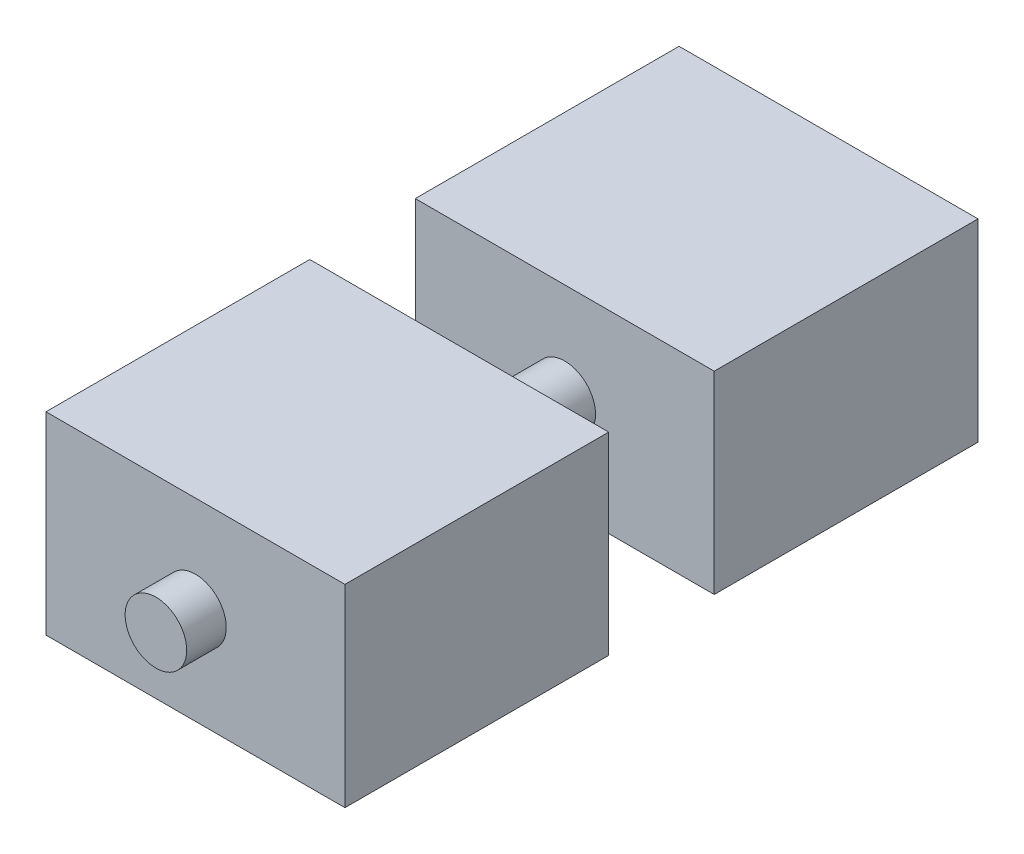
ISO-10303-21;
HEADER;
FILE_DESCRIPTION(('STEP AP214'),'2;1');
FILE_NAME('part.step','',(''),(''),'','','');
FILE_SCHEMA(('AUTOMOTIVE_DESIGN { 1 0 10303 214 1 1 1 1 }'));
ENDSEC;
DATA;
#1=APPLICATION_CONTEXT('core data for automotive mechanical design processes');
#2=APPLICATION_PROTOCOL_DEFINITION('international standard','automotive_design',2000,#1);
#3=PRODUCT_CONTEXT('',#1,'mechanical');
#4=PRODUCT('Part','Part','',(#3));
#5=PRODUCT_RELATED_PRODUCT_CATEGORY('part','',(#4));
#6=PRODUCT_DEFINITION_FORMATION('','',#4);
#7=PRODUCT_DEFINITION_CONTEXT('part definition',#1,'design');
#8=PRODUCT_DEFINITION('design','',#6,#7);
#9=PRODUCT_DEFINITION_SHAPE('','',#8);
#10=(LENGTH_UNIT() NAMED_UNIT(*) SI_UNIT(.MILLI.,.METRE.));
#11=(NAMED_UNIT(*) PLANE_ANGLE_UNIT() SI_UNIT($,.RADIAN.));
#12=(NAMED_UNIT(*) SI_UNIT($,.STERADIAN.) SOLID_ANGLE_UNIT());
#13=UNCERTAINTY_MEASURE_WITH_UNIT(LENGTH_MEASURE(1.E-05),#10,'distance_accuracy_value','');
#14=(GEOMETRIC_REPRESENTATION_CONTEXT(3) GLOBAL_UNCERTAINTY_ASSIGNED_CONTEXT((#13)) GLOBAL_UNIT_ASSIGNED_CONTEXT((#10,
#11,#12)) REPRESENTATION_CONTEXT('',''));
#15=CARTESIAN_POINT('',(0.,0.,0.));
#16=DIRECTION('',(0.,0.,1.));
#17=DIRECTION('',(1.,0.,0.));
#18=AXIS2_PLACEMENT_3D('',#15,#16,#17);
#19=CARTESIAN_POINT('',(0.,11.,-60.));
#20=DIRECTION('',(0.,0.,1.));
#21=DIRECTION('',(1.,0.,0.));
#22=AXIS2_PLACEMENT_3D('',#19,#20,#21);
#23=CYLINDRICAL_SURFACE('',#22,3.5);
#24=CARTESIAN_POINT('',(0.,11.,-15.));
#25=DIRECTION('',(0.,0.,1.));
#26=DIRECTION('',(1.,0.,0.));
#27=AXIS2_PLACEMENT_3D('',#24,#25,#26);
#28=CIRCLE('',#27,3.5);
#29=CARTESIAN_POINT('',(3.5,11.,-15.));
#30=VERTEX_POINT('',#29);
#31=EDGE_CURVE('E153',#30,#30,#28,.T.);
#32=ORIENTED_EDGE('',*,*,#31,.F.);
#33=EDGE_LOOP('',(#32));
#34=FACE_BOUND('',#33,.T.);
#35=CARTESIAN_POINT('',(0.,11.,-27.));
#36=DIRECTION('',(0.,0.,-1.));
#37=DIRECTION('',(-1.,0.,0.));
#38=AXIS2_PLACEMENT_3D('',#35,#36,#37);
#39=CIRCLE('',#38,3.5);
#40=CARTESIAN_POINT('',(-3.5,11.,-27.));
#41=VERTEX_POINT('',#40);
#42=EDGE_CURVE('E139',#41,#41,#39,.F.);
#43=ORIENTED_EDGE('',*,*,#42,.T.);
#44=EDGE_LOOP('',(#43));
#45=FACE_BOUND('',#44,.T.);
#46=ADVANCED_FACE('F37',(#34,#45),#23,.T.);
#47=CARTESIAN_POINT('',(17.,22.,-15.));
#48=DIRECTION('',(-1.,0.,0.));
#49=DIRECTION('',(0.,0.,1.));
#50=AXIS2_PLACEMENT_3D('',#47,#48,#49);
#51=PLANE('',#50);
#52=DIRECTION('',(0.,0.,-1.));
#53=VECTOR('',#52,1.);
#54=CARTESIAN_POINT('',(17.,0.,-15.));
#55=LINE('',#54,#53);
#56=CARTESIAN_POINT('',(17.,0.,15.));
#57=VERTEX_POINT('',#56);
#58=CARTESIAN_POINT('',(17.,0.,-15.));
#59=VERTEX_POINT('',#58);
#60=EDGE_CURVE('E156',#57,#59,#55,.T.);
#61=ORIENTED_EDGE('',*,*,#60,.T.);
#62=DIRECTION('',(0.,-1.,0.));
#63=VECTOR('',#62,1.);
#64=CARTESIAN_POINT('',(17.,22.,-15.));
#65=LINE('',#64,#63);
#66=CARTESIAN_POINT('',(17.,22.,-15.));
#67=VERTEX_POINT('',#66);
#68=EDGE_CURVE('E11',#67,#59,#65,.T.);
#69=ORIENTED_EDGE('',*,*,#68,.F.);
#70=DIRECTION('',(0.,0.,-1.));
#71=VECTOR('',#70,1.);
#72=CARTESIAN_POINT('',(17.,22.,-15.));
#73=LINE('',#72,#71);
#74=CARTESIAN_POINT('',(17.,22.,15.));
#75=VERTEX_POINT('',#74);
#76=EDGE_CURVE('E157',#75,#67,#73,.T.);
#77=ORIENTED_EDGE('',*,*,#76,.F.);
#78=DIRECTION('',(0.,-1.,0.));
#79=VECTOR('',#78,1.);
#80=CARTESIAN_POINT('',(17.,22.,15.));
#81=LINE('',#80,#79);
#82=EDGE_CURVE('E163',#75,#57,#81,.T.);
#83=ORIENTED_EDGE('',*,*,#82,.T.);
#84=EDGE_LOOP('',(#61,#69,#77,#83));
#85=FACE_BOUND('',#84,.T.);
#86=ADVANCED_FACE('F39',(#85),#51,.F.);
#87=CARTESIAN_POINT('',(-17.,22.,-15.));
#88=DIRECTION('',(0.,0.,1.));
#89=DIRECTION('',(1.,0.,0.));
#90=AXIS2_PLACEMENT_3D('',#87,#88,#89);
#91=PLANE('',#90);
#92=ORIENTED_EDGE('',*,*,#31,.T.);
#93=EDGE_LOOP('',(#92));
#94=FACE_BOUND('',#93,.T.);
#95=DIRECTION('',(-1.,0.,0.));
#96=VECTOR('',#95,1.);
#97=CARTESIAN_POINT('',(-17.,0.,-15.));
#98=LINE('',#97,#96);
#99=CARTESIAN_POINT('',(-17.,0.,-15.));
#100=VERTEX_POINT('',#99);
#101=EDGE_CURVE('E166',#59,#100,#98,.T.);
#102=ORIENTED_EDGE('',*,*,#101,.T.);
#103=DIRECTION('',(0.,-1.,0.));
#104=VECTOR('',#103,1.);
#105=CARTESIAN_POINT('',(-17.,22.,-15.));
#106=LINE('',#105,#104);
#107=CARTESIAN_POINT('',(-17.,22.,-15.));
#108=VERTEX_POINT('',#107);
#109=EDGE_CURVE('E47',#108,#100,#106,.T.);
#110=ORIENTED_EDGE('',*,*,#109,.F.);
#111=DIRECTION('',(-1.,0.,0.));
#112=VECTOR('',#111,1.);
#113=CARTESIAN_POINT('',(-17.,22.,-15.));
#114=LINE('',#113,#112);
#115=EDGE_CURVE('E87',#67,#108,#114,.T.);
#116=ORIENTED_EDGE('',*,*,#115,.F.);
#117=ORIENTED_EDGE('',*,*,#68,.T.);
#118=EDGE_LOOP('',(#102,#110,#116,#117));
#119=FACE_BOUND('',#118,.T.);
#120=ADVANCED_FACE('F205',(#94,#119),#91,.F.);
#121=CARTESIAN_POINT('',(-17.,22.,-15.));
#122=DIRECTION('',(1.,0.,0.));
#123=DIRECTION('',(0.,0.,-1.));
#124=AXIS2_PLACEMENT_3D('',#121,#122,#123);
#125=PLANE('',#124);
#126=DIRECTION('',(0.,0.,1.));
#127=VECTOR('',#126,1.);
#128=CARTESIAN_POINT('',(-17.,0.,-15.));
#129=LINE('',#128,#127);
#130=CARTESIAN_POINT('',(-17.,0.,15.));
#131=VERTEX_POINT('',#130);
#132=EDGE_CURVE('E74',#100,#131,#129,.T.);
#133=ORIENTED_EDGE('',*,*,#132,.T.);
#134=DIRECTION('',(0.,-1.,0.));
#135=VECTOR('',#134,1.);
#136=CARTESIAN_POINT('',(-17.,22.,15.));
#137=LINE('',#136,#135);
#138=CARTESIAN_POINT('',(-17.,22.,15.));
#139=VERTEX_POINT('',#138);
#140=EDGE_CURVE('E171',#139,#131,#137,.T.);
#141=ORIENTED_EDGE('',*,*,#140,.F.);
#142=DIRECTION('',(0.,0.,1.));
#143=VECTOR('',#142,1.);
#144=CARTESIAN_POINT('',(-17.,22.,-15.));
#145=LINE('',#144,#143);
#146=EDGE_CURVE('E160',#108,#139,#145,.T.);
#147=ORIENTED_EDGE('',*,*,#146,.F.);
#148=ORIENTED_EDGE('',*,*,#109,.T.);
#149=EDGE_LOOP('',(#133,#141,#147,#148));
#150=FACE_BOUND('',#149,.T.);
#151=ADVANCED_FACE('F305',(#150),#125,.F.);
#152=CARTESIAN_POINT('',(-17.,22.,15.));
#153=DIRECTION('',(0.,0.,-1.));
#154=DIRECTION('',(-1.,0.,0.));
#155=AXIS2_PLACEMENT_3D('',#152,#153,#154);
#156=PLANE('',#155);
#157=CARTESIAN_POINT('',(0.,11.,15.));
#158=DIRECTION('',(0.,0.,-1.));
#159=DIRECTION('',(-1.,0.,0.));
#160=AXIS2_PLACEMENT_3D('',#157,#158,#159);
#161=CIRCLE('',#160,3.5);
#162=CARTESIAN_POINT('',(-3.5,11.,15.));
#163=VERTEX_POINT('',#162);
#164=EDGE_CURVE('E152',#163,#163,#161,.T.);
#165=ORIENTED_EDGE('',*,*,#164,.T.);
#166=EDGE_LOOP('',(#165));
#167=FACE_BOUND('',#166,.T.);
#168=DIRECTION('',(1.,0.,0.));
#169=VECTOR('',#168,1.);
#170=CARTESIAN_POINT('',(-17.,0.,15.));
#171=LINE('',#170,#169);
#172=EDGE_CURVE('E80',#131,#57,#171,.T.);
#173=ORIENTED_EDGE('',*,*,#172,.T.);
#174=ORIENTED_EDGE('',*,*,#82,.F.);
#175=DIRECTION('',(1.,0.,0.));
#176=VECTOR('',#175,1.);
#177=CARTESIAN_POINT('',(-17.,22.,15.));
#178=LINE('',#177,#176);
#179=EDGE_CURVE('E56',#139,#75,#178,.T.);
#180=ORIENTED_EDGE('',*,*,#179,.F.);
#181=ORIENTED_EDGE('',*,*,#140,.T.);
#182=EDGE_LOOP('',(#173,#174,#180,#181));
#183=FACE_BOUND('',#182,.T.);
#184=ADVANCED_FACE('F177',(#167,#183),#156,.F.);
#185=CARTESIAN_POINT('',(0.,22.,0.));
#186=DIRECTION('',(0.,1.,0.));
#187=DIRECTION('',(0.,0.,1.));
#188=AXIS2_PLACEMENT_3D('',#185,#186,#187);
#189=PLANE('',#188);
#190=ORIENTED_EDGE('',*,*,#76,.T.);
#191=ORIENTED_EDGE('',*,*,#115,.T.);
#192=ORIENTED_EDGE('',*,*,#146,.T.);
#193=ORIENTED_EDGE('',*,*,#179,.T.);
#194=EDGE_LOOP('',(#190,#191,#192,#193));
#195=FACE_BOUND('',#194,.T.);
#196=ADVANCED_FACE('F294',(#195),#189,.T.);
#197=CARTESIAN_POINT('',(0.,0.,0.));
#198=DIRECTION('',(0.,1.,0.));
#199=DIRECTION('',(0.,0.,1.));
#200=AXIS2_PLACEMENT_3D('',#197,#198,#199);
#201=PLANE('',#200);
#202=CARTESIAN_POINT('',(12.,0.,8.99999999999999));
#203=DIRECTION('',(0.,-1.,0.));
#204=DIRECTION('',(0.,0.,-1.));
#205=AXIS2_PLACEMENT_3D('',#202,#203,#204);
#206=CIRCLE('',#205,2.05);
#207=CARTESIAN_POINT('',(12.,0.,6.94999999999999));
#208=VERTEX_POINT('',#207);
#209=EDGE_CURVE('E241',#208,#208,#206,.T.);
#210=ORIENTED_EDGE('',*,*,#209,.F.);
#211=EDGE_LOOP('',(#210));
#212=FACE_BOUND('',#211,.T.);
#213=CARTESIAN_POINT('',(12.,0.,-9.00000000000001));
#214=DIRECTION('',(0.,-1.,0.));
#215=DIRECTION('',(0.,0.,-1.));
#216=AXIS2_PLACEMENT_3D('',#213,#214,#215);
#217=CIRCLE('',#216,2.05);
#218=CARTESIAN_POINT('',(12.,0.,-11.05));
#219=VERTEX_POINT('',#218);
#220=EDGE_CURVE('E277',#219,#219,#217,.T.);
#221=ORIENTED_EDGE('',*,*,#220,.F.);
#222=EDGE_LOOP('',(#221));
#223=FACE_BOUND('',#222,.T.);
#224=CARTESIAN_POINT('',(-12.,0.,-9.00000000000001));
#225=DIRECTION('',(0.,-1.,0.));
#226=DIRECTION('',(0.,0.,-1.));
#227=AXIS2_PLACEMENT_3D('',#224,#225,#226);
#228=CIRCLE('',#227,2.05);
#229=CARTESIAN_POINT('',(-12.,0.,-11.05));
#230=VERTEX_POINT('',#229);
#231=EDGE_CURVE('E271',#230,#230,#228,.T.);
#232=ORIENTED_EDGE('',*,*,#231,.F.);
#233=EDGE_LOOP('',(#232));
#234=FACE_BOUND('',#233,.T.);
#235=CARTESIAN_POINT('',(-12.,0.,8.99999999999999));
#236=DIRECTION('',(0.,-1.,0.));
#237=DIRECTION('',(0.,0.,-1.));
#238=AXIS2_PLACEMENT_3D('',#235,#236,#237);
#239=CIRCLE('',#238,2.05);
#240=CARTESIAN_POINT('',(-12.,0.,6.94999999999999));
#241=VERTEX_POINT('',#240);
#242=EDGE_CURVE('E265',#241,#241,#239,.T.);
#243=ORIENTED_EDGE('',*,*,#242,.F.);
#244=EDGE_LOOP('',(#243));
#245=FACE_BOUND('',#244,.T.);
#246=ORIENTED_EDGE('',*,*,#60,.F.);
#247=ORIENTED_EDGE('',*,*,#172,.F.);
#248=ORIENTED_EDGE('',*,*,#132,.F.);
#249=ORIENTED_EDGE('',*,*,#101,.F.);
#250=EDGE_LOOP('',(#246,#247,#248,#249));
#251=FACE_BOUND('',#250,.T.);
#252=ADVANCED_FACE('F190',(#212,#223,#234,#245,#251),#201,.F.);
#253=CARTESIAN_POINT('',(0.,11.,19.5));
#254=DIRECTION('',(0.,0.,1.));
#255=DIRECTION('',(1.,0.,0.));
#256=AXIS2_PLACEMENT_3D('',#253,#254,#255);
#257=PLANE('',#256);
#258=CARTESIAN_POINT('',(0.,11.,19.5));
#259=DIRECTION('',(0.,0.,1.));
#260=DIRECTION('',(1.,0.,0.));
#261=AXIS2_PLACEMENT_3D('',#258,#259,#260);
#262=CIRCLE('',#261,3.5);
#263=CARTESIAN_POINT('',(3.5,11.,19.5));
#264=VERTEX_POINT('',#263);
#265=EDGE_CURVE('E146',#264,#264,#262,.T.);
#266=ORIENTED_EDGE('',*,*,#265,.T.);
#267=EDGE_LOOP('',(#266));
#268=FACE_BOUND('',#267,.T.);
#269=ADVANCED_FACE('F181',(#268),#257,.T.);
#270=ORIENTED_EDGE('',*,*,#265,.F.);
#271=EDGE_LOOP('',(#270));
#272=FACE_BOUND('',#271,.T.);
#273=ORIENTED_EDGE('',*,*,#164,.F.);
#274=EDGE_LOOP('',(#273));
#275=FACE_BOUND('',#274,.T.);
#276=ADVANCED_FACE('F179',(#272,#275),#23,.T.);
#277=CARTESIAN_POINT('',(17.,22.,-57.));
#278=DIRECTION('',(-1.,0.,0.));
#279=DIRECTION('',(0.,0.,1.));
#280=AXIS2_PLACEMENT_3D('',#277,#278,#279);
#281=PLANE('',#280);
#282=DIRECTION('',(0.,0.,-1.));
#283=VECTOR('',#282,1.);
#284=CARTESIAN_POINT('',(17.,0.,-57.));
#285=LINE('',#284,#283);
#286=CARTESIAN_POINT('',(17.,0.,-27.));
#287=VERTEX_POINT('',#286);
#288=CARTESIAN_POINT('',(17.,0.,-57.));
#289=VERTEX_POINT('',#288);
#290=EDGE_CURVE('E138',#287,#289,#285,.T.);
#291=ORIENTED_EDGE('',*,*,#290,.T.);
#292=DIRECTION('',(0.,-1.,0.));
#293=VECTOR('',#292,1.);
#294=CARTESIAN_POINT('',(17.,22.,-57.));
#295=LINE('',#294,#293);
#296=CARTESIAN_POINT('',(17.,22.,-57.));
#297=VERTEX_POINT('',#296);
#298=EDGE_CURVE('E118',#297,#289,#295,.T.);
#299=ORIENTED_EDGE('',*,*,#298,.F.);
#300=DIRECTION('',(0.,0.,-1.));
#301=VECTOR('',#300,1.);
#302=CARTESIAN_POINT('',(17.,22.,-57.));
#303=LINE('',#302,#301);
#304=CARTESIAN_POINT('',(17.,22.,-27.));
#305=VERTEX_POINT('',#304);
#306=EDGE_CURVE('E125',#305,#297,#303,.T.);
#307=ORIENTED_EDGE('',*,*,#306,.F.);
#308=DIRECTION('',(0.,-1.,0.));
#309=VECTOR('',#308,1.);
#310=CARTESIAN_POINT('',(17.,22.,-27.));
#311=LINE('',#310,#309);
#312=EDGE_CURVE('E218',#305,#287,#311,.T.);
#313=ORIENTED_EDGE('',*,*,#312,.T.);
#314=EDGE_LOOP('',(#291,#299,#307,#313));
#315=FACE_BOUND('',#314,.T.);
#316=ADVANCED_FACE('F136',(#315),#281,.F.);
#317=CARTESIAN_POINT('',(-17.,22.,-57.));
#318=DIRECTION('',(0.,0.,1.));
#319=DIRECTION('',(1.,0.,0.));
#320=AXIS2_PLACEMENT_3D('',#317,#318,#319);
#321=PLANE('',#320);
#322=CARTESIAN_POINT('',(0.,11.,-57.));
#323=DIRECTION('',(0.,0.,1.));
#324=DIRECTION('',(1.,0.,0.));
#325=AXIS2_PLACEMENT_3D('',#322,#323,#324);
#326=CIRCLE('',#325,3.5);
#327=CARTESIAN_POINT('',(3.5,11.,-57.));
#328=VERTEX_POINT('',#327);
#329=EDGE_CURVE('E41',#328,#328,#326,.F.);
#330=ORIENTED_EDGE('',*,*,#329,.F.);
#331=EDGE_LOOP('',(#330));
#332=FACE_BOUND('',#331,.T.);
#333=DIRECTION('',(-1.,0.,0.));
#334=VECTOR('',#333,1.);
#335=CARTESIAN_POINT('',(-17.,0.,-57.));
#336=LINE('',#335,#334);
#337=CARTESIAN_POINT('',(-17.,0.,-57.));
#338=VERTEX_POINT('',#337);
#339=EDGE_CURVE('E226',#289,#338,#336,.T.);
#340=ORIENTED_EDGE('',*,*,#339,.T.);
#341=DIRECTION('',(0.,-1.,0.));
#342=VECTOR('',#341,1.);
#343=CARTESIAN_POINT('',(-17.,22.,-57.));
#344=LINE('',#343,#342);
#345=CARTESIAN_POINT('',(-17.,22.,-57.));
#346=VERTEX_POINT('',#345);
#347=EDGE_CURVE('E121',#346,#338,#344,.T.);
#348=ORIENTED_EDGE('',*,*,#347,.F.);
#349=DIRECTION('',(-1.,0.,0.));
#350=VECTOR('',#349,1.);
#351=CARTESIAN_POINT('',(-17.,22.,-57.));
#352=LINE('',#351,#350);
#353=EDGE_CURVE('E114',#297,#346,#352,.T.);
#354=ORIENTED_EDGE('',*,*,#353,.F.);
#355=ORIENTED_EDGE('',*,*,#298,.T.);
#356=EDGE_LOOP('',(#340,#348,#354,#355));
#357=FACE_BOUND('',#356,.T.);
#358=ADVANCED_FACE('F116',(#332,#357),#321,.F.);
#359=CARTESIAN_POINT('',(-17.,22.,-57.));
#360=DIRECTION('',(1.,0.,0.));
#361=DIRECTION('',(0.,0.,-1.));
#362=AXIS2_PLACEMENT_3D('',#359,#360,#361);
#363=PLANE('',#362);
#364=DIRECTION('',(0.,0.,1.));
#365=VECTOR('',#364,1.);
#366=CARTESIAN_POINT('',(-17.,0.,-57.));
#367=LINE('',#366,#365);
#368=CARTESIAN_POINT('',(-17.,0.,-27.));
#369=VERTEX_POINT('',#368);
#370=EDGE_CURVE('E222',#338,#369,#367,.T.);
#371=ORIENTED_EDGE('',*,*,#370,.T.);
#372=DIRECTION('',(0.,-1.,0.));
#373=VECTOR('',#372,1.);
#374=CARTESIAN_POINT('',(-17.,22.,-27.));
#375=LINE('',#374,#373);
#376=CARTESIAN_POINT('',(-17.,22.,-27.));
#377=VERTEX_POINT('',#376);
#378=EDGE_CURVE('E142',#377,#369,#375,.T.);
#379=ORIENTED_EDGE('',*,*,#378,.F.);
#380=DIRECTION('',(0.,0.,1.));
#381=VECTOR('',#380,1.);
#382=CARTESIAN_POINT('',(-17.,22.,-57.));
#383=LINE('',#382,#381);
#384=EDGE_CURVE('E124',#346,#377,#383,.T.);
#385=ORIENTED_EDGE('',*,*,#384,.F.);
#386=ORIENTED_EDGE('',*,*,#347,.T.);
#387=EDGE_LOOP('',(#371,#379,#385,#386));
#388=FACE_BOUND('',#387,.T.);
#389=ADVANCED_FACE('F214',(#388),#363,.F.);
#390=CARTESIAN_POINT('',(-17.,22.,-27.));
#391=DIRECTION('',(0.,0.,-1.));
#392=DIRECTION('',(-1.,0.,0.));
#393=AXIS2_PLACEMENT_3D('',#390,#391,#392);
#394=PLANE('',#393);
#395=ORIENTED_EDGE('',*,*,#42,.F.);
#396=EDGE_LOOP('',(#395));
#397=FACE_BOUND('',#396,.T.);
#398=DIRECTION('',(1.,0.,0.));
#399=VECTOR('',#398,1.);
#400=CARTESIAN_POINT('',(-17.,0.,-27.));
#401=LINE('',#400,#399);
#402=EDGE_CURVE('E134',#369,#287,#401,.T.);
#403=ORIENTED_EDGE('',*,*,#402,.T.);
#404=ORIENTED_EDGE('',*,*,#312,.F.);
#405=DIRECTION('',(1.,0.,0.));
#406=VECTOR('',#405,1.);
#407=CARTESIAN_POINT('',(-17.,22.,-27.));
#408=LINE('',#407,#406);
#409=EDGE_CURVE('E130',#377,#305,#408,.T.);
#410=ORIENTED_EDGE('',*,*,#409,.F.);
#411=ORIENTED_EDGE('',*,*,#378,.T.);
#412=EDGE_LOOP('',(#403,#404,#410,#411));
#413=FACE_BOUND('',#412,.T.);
#414=ADVANCED_FACE('F211',(#397,#413),#394,.F.);
#415=CARTESIAN_POINT('',(0.,22.,0.));
#416=DIRECTION('',(0.,1.,0.));
#417=DIRECTION('',(0.,0.,1.));
#418=AXIS2_PLACEMENT_3D('',#415,#416,#417);
#419=PLANE('',#418);
#420=ORIENTED_EDGE('',*,*,#306,.T.);
#421=ORIENTED_EDGE('',*,*,#353,.T.);
#422=ORIENTED_EDGE('',*,*,#384,.T.);
#423=ORIENTED_EDGE('',*,*,#409,.T.);
#424=EDGE_LOOP('',(#420,#421,#422,#423));
#425=FACE_BOUND('',#424,.T.);
#426=ADVANCED_FACE('F128',(#425),#419,.T.);
#427=CARTESIAN_POINT('',(0.,0.,0.));
#428=DIRECTION('',(0.,1.,0.));
#429=DIRECTION('',(0.,0.,1.));
#430=AXIS2_PLACEMENT_3D('',#427,#428,#429);
#431=PLANE('',#430);
#432=CARTESIAN_POINT('',(-11.75,0.,-33.25));
#433=DIRECTION('',(0.,-1.,0.));
#434=DIRECTION('',(0.,0.,-1.));
#435=AXIS2_PLACEMENT_3D('',#432,#433,#434);
#436=CIRCLE('',#435,2.05000000000001);
#437=CARTESIAN_POINT('',(-11.75,0.,-35.3));
#438=VERTEX_POINT('',#437);
#439=EDGE_CURVE('E260',#438,#438,#436,.T.);
#440=ORIENTED_EDGE('',*,*,#439,.F.);
#441=EDGE_LOOP('',(#440));
#442=FACE_BOUND('',#441,.T.);
#443=CARTESIAN_POINT('',(-11.75,0.,-50.75));
#444=DIRECTION('',(0.,-1.,0.));
#445=DIRECTION('',(0.,0.,-1.));
#446=AXIS2_PLACEMENT_3D('',#443,#444,#445);
#447=CIRCLE('',#446,2.05000000000001);
#448=CARTESIAN_POINT('',(-11.75,0.,-52.8));
#449=VERTEX_POINT('',#448);
#450=EDGE_CURVE('E254',#449,#449,#447,.T.);
#451=ORIENTED_EDGE('',*,*,#450,.F.);
#452=EDGE_LOOP('',(#451));
#453=FACE_BOUND('',#452,.T.);
#454=CARTESIAN_POINT('',(11.75,0.,-50.75));
#455=DIRECTION('',(0.,-1.,0.));
#456=DIRECTION('',(0.,0.,-1.));
#457=AXIS2_PLACEMENT_3D('',#454,#455,#456);
#458=CIRCLE('',#457,2.05000000000001);
#459=CARTESIAN_POINT('',(11.75,0.,-52.8));
#460=VERTEX_POINT('',#459);
#461=EDGE_CURVE('E248',#460,#460,#458,.T.);
#462=ORIENTED_EDGE('',*,*,#461,.F.);
#463=EDGE_LOOP('',(#462));
#464=FACE_BOUND('',#463,.T.);
#465=CARTESIAN_POINT('',(11.75,0.,-33.25));
#466=DIRECTION('',(0.,-1.,0.));
#467=DIRECTION('',(0.,0.,-1.));
#468=AXIS2_PLACEMENT_3D('',#465,#466,#467);
#469=CIRCLE('',#468,2.05000000000001);
#470=CARTESIAN_POINT('',(11.75,0.,-35.3));
#471=VERTEX_POINT('',#470);
#472=EDGE_CURVE('E231',#471,#471,#469,.T.);
#473=ORIENTED_EDGE('',*,*,#472,.F.);
#474=EDGE_LOOP('',(#473));
#475=FACE_BOUND('',#474,.T.);
#476=ORIENTED_EDGE('',*,*,#290,.F.);
#477=ORIENTED_EDGE('',*,*,#402,.F.);
#478=ORIENTED_EDGE('',*,*,#370,.F.);
#479=ORIENTED_EDGE('',*,*,#339,.F.);
#480=EDGE_LOOP('',(#476,#477,#478,#479));
#481=FACE_BOUND('',#480,.T.);
#482=ADVANCED_FACE('F225',(#442,#453,#464,#475,#481),#431,.F.);
#483=CARTESIAN_POINT('',(0.,11.,-60.));
#484=DIRECTION('',(0.,0.,1.));
#485=DIRECTION('',(1.,0.,0.));
#486=AXIS2_PLACEMENT_3D('',#483,#484,#485);
#487=PLANE('',#486);
#488=CARTESIAN_POINT('',(0.,11.,-60.));
#489=DIRECTION('',(0.,0.,1.));
#490=DIRECTION('',(1.,0.,0.));
#491=AXIS2_PLACEMENT_3D('',#488,#489,#490);
#492=CIRCLE('',#491,3.5);
#493=CARTESIAN_POINT('',(3.5,11.,-60.));
#494=VERTEX_POINT('',#493);
#495=EDGE_CURVE('E149',#494,#494,#492,.T.);
#496=ORIENTED_EDGE('',*,*,#495,.F.);
#497=EDGE_LOOP('',(#496));
#498=FACE_BOUND('',#497,.T.);
#499=ADVANCED_FACE('F198',(#498),#487,.F.);
#500=ORIENTED_EDGE('',*,*,#495,.T.);
#501=EDGE_LOOP('',(#500));
#502=FACE_BOUND('',#501,.T.);
#503=ORIENTED_EDGE('',*,*,#329,.T.);
#504=EDGE_LOOP('',(#503));
#505=FACE_BOUND('',#504,.T.);
#506=ADVANCED_FACE('F184',(#502,#505),#23,.T.);
#507=CARTESIAN_POINT('',(11.75,5.,-33.25));
#508=DIRECTION('',(0.,-1.,0.));
#509=DIRECTION('',(0.,0.,-1.));
#510=AXIS2_PLACEMENT_3D('',#507,#508,#509);
#511=CYLINDRICAL_SURFACE('',#510,2.05000000000001);
#512=CARTESIAN_POINT('',(11.75,5.,-33.25));
#513=DIRECTION('',(0.,-1.,0.));
#514=DIRECTION('',(0.,0.,-1.));
#515=AXIS2_PLACEMENT_3D('',#512,#513,#514);
#516=CIRCLE('',#515,2.05000000000001);
#517=CARTESIAN_POINT('',(11.75,5.,-35.3));
#518=VERTEX_POINT('',#517);
#519=EDGE_CURVE('E227',#518,#518,#516,.T.);
#520=ORIENTED_EDGE('',*,*,#519,.F.);
#521=EDGE_LOOP('',(#520));
#522=FACE_BOUND('',#521,.T.);
#523=ORIENTED_EDGE('',*,*,#472,.T.);
#524=EDGE_LOOP('',(#523));
#525=FACE_BOUND('',#524,.T.);
#526=ADVANCED_FACE('F197',(#522,#525),#511,.F.);
#527=CARTESIAN_POINT('',(11.75,5.,-33.25));
#528=DIRECTION('',(0.,-1.,0.));
#529=DIRECTION('',(0.,0.,-1.));
#530=AXIS2_PLACEMENT_3D('',#527,#528,#529);
#531=PLANE('',#530);
#532=ORIENTED_EDGE('',*,*,#519,.T.);
#533=EDGE_LOOP('',(#532));
#534=FACE_BOUND('',#533,.T.);
#535=ADVANCED_FACE('F398',(#534),#531,.T.);
#536=CARTESIAN_POINT('',(11.75,5.,-50.75));
#537=DIRECTION('',(0.,-1.,0.));
#538=DIRECTION('',(0.,0.,-1.));
#539=AXIS2_PLACEMENT_3D('',#536,#537,#538);
#540=CYLINDRICAL_SURFACE('',#539,2.05000000000001);
#541=CARTESIAN_POINT('',(11.75,5.,-50.75));
#542=DIRECTION('',(0.,-1.,0.));
#543=DIRECTION('',(0.,0.,-1.));
#544=AXIS2_PLACEMENT_3D('',#541,#542,#543);
#545=CIRCLE('',#544,2.05000000000001);
#546=CARTESIAN_POINT('',(11.75,5.,-52.8));
#547=VERTEX_POINT('',#546);
#548=EDGE_CURVE('E251',#547,#547,#545,.T.);
#549=ORIENTED_EDGE('',*,*,#548,.F.);
#550=EDGE_LOOP('',(#549));
#551=FACE_BOUND('',#550,.T.);
#552=ORIENTED_EDGE('',*,*,#461,.T.);
#553=EDGE_LOOP('',(#552));
#554=FACE_BOUND('',#553,.T.);
#555=ADVANCED_FACE('F405',(#551,#554),#540,.F.);
#556=CARTESIAN_POINT('',(11.75,5.,-50.75));
#557=DIRECTION('',(0.,-1.,0.));
#558=DIRECTION('',(0.,0.,-1.));
#559=AXIS2_PLACEMENT_3D('',#556,#557,#558);
#560=PLANE('',#559);
#561=ORIENTED_EDGE('',*,*,#548,.T.);
#562=EDGE_LOOP('',(#561));
#563=FACE_BOUND('',#562,.T.);
#564=ADVANCED_FACE('F413',(#563),#560,.T.);
#565=CARTESIAN_POINT('',(-11.75,5.,-50.75));
#566=DIRECTION('',(0.,-1.,0.));
#567=DIRECTION('',(0.,0.,-1.));
#568=AXIS2_PLACEMENT_3D('',#565,#566,#567);
#569=CYLINDRICAL_SURFACE('',#568,2.05000000000001);
#570=CARTESIAN_POINT('',(-11.75,5.,-50.75));
#571=DIRECTION('',(0.,-1.,0.));
#572=DIRECTION('',(0.,0.,-1.));
#573=AXIS2_PLACEMENT_3D('',#570,#571,#572);
#574=CIRCLE('',#573,2.05000000000001);
#575=CARTESIAN_POINT('',(-11.75,5.,-52.8));
#576=VERTEX_POINT('',#575);
#577=EDGE_CURVE('E257',#576,#576,#574,.T.);
#578=ORIENTED_EDGE('',*,*,#577,.F.);
#579=EDGE_LOOP('',(#578));
#580=FACE_BOUND('',#579,.T.);
#581=ORIENTED_EDGE('',*,*,#450,.T.);
#582=EDGE_LOOP('',(#581));
#583=FACE_BOUND('',#582,.T.);
#584=ADVANCED_FACE('F421',(#580,#583),#569,.F.);
#585=CARTESIAN_POINT('',(-11.75,5.,-50.75));
#586=DIRECTION('',(0.,-1.,0.));
#587=DIRECTION('',(0.,0.,-1.));
#588=AXIS2_PLACEMENT_3D('',#585,#586,#587);
#589=PLANE('',#588);
#590=ORIENTED_EDGE('',*,*,#577,.T.);
#591=EDGE_LOOP('',(#590));
#592=FACE_BOUND('',#591,.T.);
#593=ADVANCED_FACE('F429',(#592),#589,.T.);
#594=CARTESIAN_POINT('',(-11.75,5.,-33.25));
#595=DIRECTION('',(0.,-1.,0.));
#596=DIRECTION('',(0.,0.,-1.));
#597=AXIS2_PLACEMENT_3D('',#594,#595,#596);
#598=CYLINDRICAL_SURFACE('',#597,2.05000000000001);
#599=CARTESIAN_POINT('',(-11.75,5.,-33.25));
#600=DIRECTION('',(0.,-1.,0.));
#601=DIRECTION('',(0.,0.,-1.));
#602=AXIS2_PLACEMENT_3D('',#599,#600,#601);
#603=CIRCLE('',#602,2.05000000000001);
#604=CARTESIAN_POINT('',(-11.75,5.,-35.3));
#605=VERTEX_POINT('',#604);
#606=EDGE_CURVE('E239',#605,#605,#603,.T.);
#607=ORIENTED_EDGE('',*,*,#606,.F.);
#608=EDGE_LOOP('',(#607));
#609=FACE_BOUND('',#608,.T.);
#610=ORIENTED_EDGE('',*,*,#439,.T.);
#611=EDGE_LOOP('',(#610));
#612=FACE_BOUND('',#611,.T.);
#613=ADVANCED_FACE('F437',(#609,#612),#598,.F.);
#614=CARTESIAN_POINT('',(-11.75,5.,-33.25));
#615=DIRECTION('',(0.,-1.,0.));
#616=DIRECTION('',(0.,0.,-1.));
#617=AXIS2_PLACEMENT_3D('',#614,#615,#616);
#618=PLANE('',#617);
#619=ORIENTED_EDGE('',*,*,#606,.T.);
#620=EDGE_LOOP('',(#619));
#621=FACE_BOUND('',#620,.T.);
#622=ADVANCED_FACE('F445',(#621),#618,.T.);
#623=CARTESIAN_POINT('',(-12.,5.,8.99999999999999));
#624=DIRECTION('',(0.,-1.,0.));
#625=DIRECTION('',(0.,0.,-1.));
#626=AXIS2_PLACEMENT_3D('',#623,#624,#625);
#627=CYLINDRICAL_SURFACE('',#626,2.05);
#628=CARTESIAN_POINT('',(-12.,5.,8.99999999999999));
#629=DIRECTION('',(0.,-1.,0.));
#630=DIRECTION('',(0.,0.,-1.));
#631=AXIS2_PLACEMENT_3D('',#628,#629,#630);
#632=CIRCLE('',#631,2.05);
#633=CARTESIAN_POINT('',(-12.,5.,6.94999999999999));
#634=VERTEX_POINT('',#633);
#635=EDGE_CURVE('E268',#634,#634,#632,.T.);
#636=ORIENTED_EDGE('',*,*,#635,.F.);
#637=EDGE_LOOP('',(#636));
#638=FACE_BOUND('',#637,.T.);
#639=ORIENTED_EDGE('',*,*,#242,.T.);
#640=EDGE_LOOP('',(#639));
#641=FACE_BOUND('',#640,.T.);
#642=ADVANCED_FACE('F453',(#638,#641),#627,.F.);
#643=CARTESIAN_POINT('',(-12.,5.,8.99999999999999));
#644=DIRECTION('',(0.,-1.,0.));
#645=DIRECTION('',(0.,0.,-1.));
#646=AXIS2_PLACEMENT_3D('',#643,#644,#645);
#647=PLANE('',#646);
#648=ORIENTED_EDGE('',*,*,#635,.T.);
#649=EDGE_LOOP('',(#648));
#650=FACE_BOUND('',#649,.T.);
#651=ADVANCED_FACE('F461',(#650),#647,.T.);
#652=CARTESIAN_POINT('',(-12.,5.,-9.00000000000001));
#653=DIRECTION('',(0.,-1.,0.));
#654=DIRECTION('',(0.,0.,-1.));
#655=AXIS2_PLACEMENT_3D('',#652,#653,#654);
#656=CYLINDRICAL_SURFACE('',#655,2.05);
#657=CARTESIAN_POINT('',(-12.,5.,-9.00000000000001));
#658=DIRECTION('',(0.,-1.,0.));
#659=DIRECTION('',(0.,0.,-1.));
#660=AXIS2_PLACEMENT_3D('',#657,#658,#659);
#661=CIRCLE('',#660,2.05);
#662=CARTESIAN_POINT('',(-12.,5.,-11.05));
#663=VERTEX_POINT('',#662);
#664=EDGE_CURVE('E274',#663,#663,#661,.T.);
#665=ORIENTED_EDGE('',*,*,#664,.F.);
#666=EDGE_LOOP('',(#665));
#667=FACE_BOUND('',#666,.T.);
#668=ORIENTED_EDGE('',*,*,#231,.T.);
#669=EDGE_LOOP('',(#668));
#670=FACE_BOUND('',#669,.T.);
#671=ADVANCED_FACE('F469',(#667,#670),#656,.F.);
#672=CARTESIAN_POINT('',(-12.,5.,-9.00000000000001));
#673=DIRECTION('',(0.,-1.,0.));
#674=DIRECTION('',(0.,0.,-1.));
#675=AXIS2_PLACEMENT_3D('',#672,#673,#674);
#676=PLANE('',#675);
#677=ORIENTED_EDGE('',*,*,#664,.T.);
#678=EDGE_LOOP('',(#677));
#679=FACE_BOUND('',#678,.T.);
#680=ADVANCED_FACE('F288',(#679),#676,.T.);
#681=CARTESIAN_POINT('',(12.,5.,-9.00000000000001));
#682=DIRECTION('',(0.,-1.,0.));
#683=DIRECTION('',(0.,0.,-1.));
#684=AXIS2_PLACEMENT_3D('',#681,#682,#683);
#685=CYLINDRICAL_SURFACE('',#684,2.05);
#686=CARTESIAN_POINT('',(12.,5.,-9.00000000000001));
#687=DIRECTION('',(0.,-1.,0.));
#688=DIRECTION('',(0.,0.,-1.));
#689=AXIS2_PLACEMENT_3D('',#686,#687,#688);
#690=CIRCLE('',#689,2.05);
#691=CARTESIAN_POINT('',(12.,5.,-11.05));
#692=VERTEX_POINT('',#691);
#693=EDGE_CURVE('E245',#692,#692,#690,.T.);
#694=ORIENTED_EDGE('',*,*,#693,.F.);
#695=EDGE_LOOP('',(#694));
#696=FACE_BOUND('',#695,.T.);
#697=ORIENTED_EDGE('',*,*,#220,.T.);
#698=EDGE_LOOP('',(#697));
#699=FACE_BOUND('',#698,.T.);
#700=ADVANCED_FACE('F285',(#696,#699),#685,.F.);
#701=CARTESIAN_POINT('',(12.,5.,-9.00000000000001));
#702=DIRECTION('',(0.,-1.,0.));
#703=DIRECTION('',(0.,0.,-1.));
#704=AXIS2_PLACEMENT_3D('',#701,#702,#703);
#705=PLANE('',#704);
#706=ORIENTED_EDGE('',*,*,#693,.T.);
#707=EDGE_LOOP('',(#706));
#708=FACE_BOUND('',#707,.T.);
#709=ADVANCED_FACE('F283',(#708),#705,.T.);
#710=CARTESIAN_POINT('',(12.,5.,8.99999999999999));
#711=DIRECTION('',(0.,-1.,0.));
#712=DIRECTION('',(0.,0.,-1.));
#713=AXIS2_PLACEMENT_3D('',#710,#711,#712);
#714=CYLINDRICAL_SURFACE('',#713,2.05);
#715=CARTESIAN_POINT('',(12.,5.,8.99999999999999));
#716=DIRECTION('',(0.,-1.,0.));
#717=DIRECTION('',(0.,0.,-1.));
#718=AXIS2_PLACEMENT_3D('',#715,#716,#717);
#719=CIRCLE('',#718,2.05);
#720=CARTESIAN_POINT('',(12.,5.,6.94999999999999));
#721=VERTEX_POINT('',#720);
#722=EDGE_CURVE('E244',#721,#721,#719,.T.);
#723=ORIENTED_EDGE('',*,*,#722,.F.);
#724=EDGE_LOOP('',(#723));
#725=FACE_BOUND('',#724,.T.);
#726=ORIENTED_EDGE('',*,*,#209,.T.);
#727=EDGE_LOOP('',(#726));
#728=FACE_BOUND('',#727,.T.);
#729=ADVANCED_FACE('F495',(#725,#728),#714,.F.);
#730=CARTESIAN_POINT('',(12.,5.,8.99999999999999));
#731=DIRECTION('',(0.,-1.,0.));
#732=DIRECTION('',(0.,0.,-1.));
#733=AXIS2_PLACEMENT_3D('',#730,#731,#732);
#734=PLANE('',#733);
#735=ORIENTED_EDGE('',*,*,#722,.T.);
#736=EDGE_LOOP('',(#735));
#737=FACE_BOUND('',#736,.T.);
#738=ADVANCED_FACE('F502',(#737),#734,.T.);
#739=CLOSED_SHELL('',(#46,#86,#120,#151,#184,#196,#252,#269,#276,#316,#358,#389,#414,#426,#482,
#499,#506,#526,#535,#555,#564,#584,#593,#613,#622,#642,#651,#671,#680,#700,#709,#729,#738));
#740=MANIFOLD_SOLID_BREP('B2',#739);
#741=ADVANCED_BREP_SHAPE_REPRESENTATION('',(#18,#740),#14);
#742=SHAPE_DEFINITION_REPRESENTATION(#9,#741);
ENDSEC;
END-ISO-10303-21;
